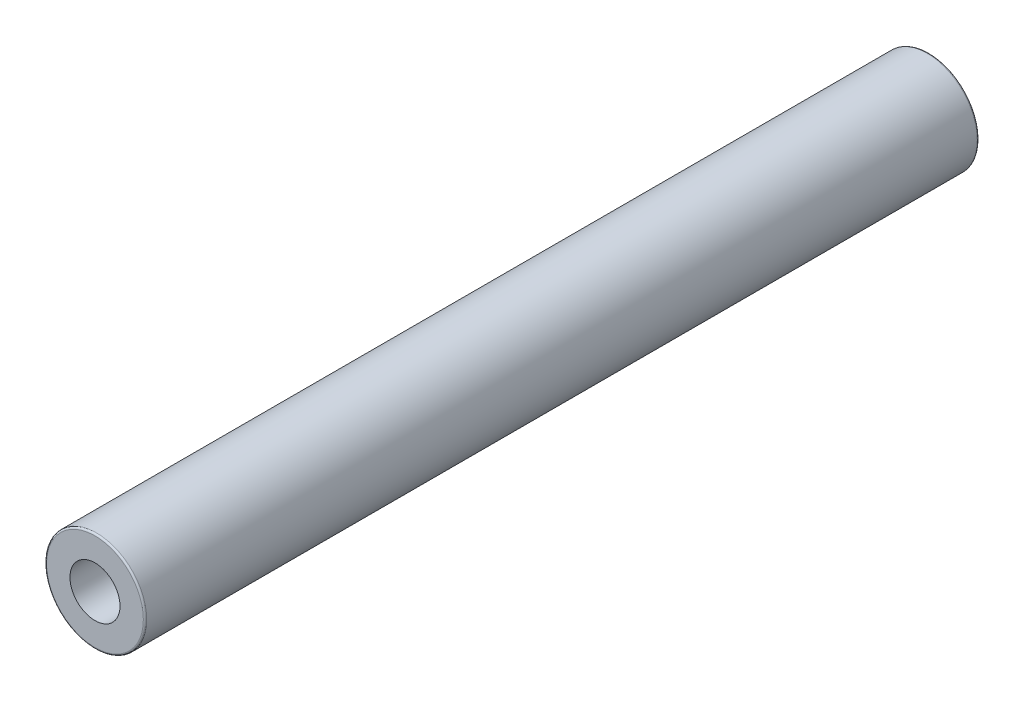
ISO-10303-21;
HEADER;
FILE_DESCRIPTION(('STEP AP214'),'2;1');
FILE_NAME('part.step','',(''),(''),'','','');
FILE_SCHEMA(('AUTOMOTIVE_DESIGN { 1 0 10303 214 1 1 1 1 }'));
ENDSEC;
DATA;
#1=APPLICATION_CONTEXT('core data for automotive mechanical design processes');
#2=APPLICATION_PROTOCOL_DEFINITION('international standard','automotive_design',2000,#1);
#3=PRODUCT_CONTEXT('',#1,'mechanical');
#4=PRODUCT('Part','Part','',(#3));
#5=PRODUCT_RELATED_PRODUCT_CATEGORY('part','',(#4));
#6=PRODUCT_DEFINITION_FORMATION('','',#4);
#7=PRODUCT_DEFINITION_CONTEXT('part definition',#1,'design');
#8=PRODUCT_DEFINITION('design','',#6,#7);
#9=PRODUCT_DEFINITION_SHAPE('','',#8);
#10=(LENGTH_UNIT() NAMED_UNIT(*) SI_UNIT(.MILLI.,.METRE.));
#11=(NAMED_UNIT(*) PLANE_ANGLE_UNIT() SI_UNIT($,.RADIAN.));
#12=(NAMED_UNIT(*) SI_UNIT($,.STERADIAN.) SOLID_ANGLE_UNIT());
#13=UNCERTAINTY_MEASURE_WITH_UNIT(LENGTH_MEASURE(1.E-05),#10,'distance_accuracy_value','');
#14=(GEOMETRIC_REPRESENTATION_CONTEXT(3) GLOBAL_UNCERTAINTY_ASSIGNED_CONTEXT((#13)) GLOBAL_UNIT_ASSIGNED_CONTEXT((#10,
#11,#12)) REPRESENTATION_CONTEXT('',''));
#15=CARTESIAN_POINT('',(0.,0.,0.));
#16=DIRECTION('',(0.,0.,1.));
#17=DIRECTION('',(1.,0.,0.));
#18=AXIS2_PLACEMENT_3D('',#15,#16,#17);
#19=CARTESIAN_POINT('',(0.,0.,50.));
#20=DIRECTION('',(0.,0.,1.));
#21=DIRECTION('',(1.,0.,0.));
#22=AXIS2_PLACEMENT_3D('',#19,#20,#21);
#23=PLANE('',#22);
#24=CARTESIAN_POINT('',(0.,0.,50.));
#25=DIRECTION('',(0.,0.,1.));
#26=DIRECTION('',(1.,0.,0.));
#27=AXIS2_PLACEMENT_3D('',#24,#25,#26);
#28=CIRCLE('',#27,2.9);
#29=CARTESIAN_POINT('',(2.9,0.,50.));
#30=VERTEX_POINT('',#29);
#31=EDGE_CURVE('E10',#30,#30,#28,.T.);
#32=ORIENTED_EDGE('',*,*,#31,.T.);
#33=EDGE_LOOP('',(#32));
#34=FACE_BOUND('',#33,.T.);
#35=CARTESIAN_POINT('',(0.,0.,50.));
#36=DIRECTION('',(0.,0.,1.));
#37=DIRECTION('',(1.,0.,0.));
#38=AXIS2_PLACEMENT_3D('',#35,#36,#37);
#39=CIRCLE('',#38,1.5);
#40=CARTESIAN_POINT('',(1.5,0.,50.));
#41=VERTEX_POINT('',#40);
#42=EDGE_CURVE('E61',#41,#41,#39,.T.);
#43=ORIENTED_EDGE('',*,*,#42,.F.);
#44=EDGE_LOOP('',(#43));
#45=FACE_BOUND('',#44,.T.);
#46=ADVANCED_FACE('F37',(#34,#45),#23,.T.);
#47=CARTESIAN_POINT('',(0.,0.,0.));
#48=DIRECTION('',(0.,0.,1.));
#49=DIRECTION('',(1.,0.,0.));
#50=AXIS2_PLACEMENT_3D('',#47,#48,#49);
#51=PLANE('',#50);
#52=CARTESIAN_POINT('',(0.,0.,0.));
#53=DIRECTION('',(0.,0.,1.));
#54=DIRECTION('',(1.,0.,0.));
#55=AXIS2_PLACEMENT_3D('',#52,#53,#54);
#56=CIRCLE('',#55,2.9);
#57=CARTESIAN_POINT('',(2.9,0.,0.));
#58=VERTEX_POINT('',#57);
#59=EDGE_CURVE('E45',#58,#58,#56,.F.);
#60=ORIENTED_EDGE('',*,*,#59,.T.);
#61=EDGE_LOOP('',(#60));
#62=FACE_BOUND('',#61,.T.);
#63=CARTESIAN_POINT('',(0.,0.,0.));
#64=DIRECTION('',(0.,0.,1.));
#65=DIRECTION('',(1.,0.,0.));
#66=AXIS2_PLACEMENT_3D('',#63,#64,#65);
#67=CIRCLE('',#66,1.5);
#68=CARTESIAN_POINT('',(1.5,0.,0.));
#69=VERTEX_POINT('',#68);
#70=EDGE_CURVE('E62',#69,#69,#67,.T.);
#71=ORIENTED_EDGE('',*,*,#70,.T.);
#72=EDGE_LOOP('',(#71));
#73=FACE_BOUND('',#72,.T.);
#74=ADVANCED_FACE('F74',(#62,#73),#51,.F.);
#75=CARTESIAN_POINT('',(0.,0.,50.));
#76=DIRECTION('',(0.,0.,-1.));
#77=DIRECTION('',(-1.,0.,0.));
#78=AXIS2_PLACEMENT_3D('',#75,#76,#77);
#79=CYLINDRICAL_SURFACE('',#78,3.);
#80=CARTESIAN_POINT('',(0.,0.,0.100000000000003));
#81=DIRECTION('',(0.,0.,1.));
#82=DIRECTION('',(1.,0.,0.));
#83=AXIS2_PLACEMENT_3D('',#80,#81,#82);
#84=CIRCLE('',#83,3.);
#85=CARTESIAN_POINT('',(3.,0.,0.100000000000003));
#86=VERTEX_POINT('',#85);
#87=EDGE_CURVE('E50',#86,#86,#84,.T.);
#88=ORIENTED_EDGE('',*,*,#87,.T.);
#89=EDGE_LOOP('',(#88));
#90=FACE_BOUND('',#89,.T.);
#91=CARTESIAN_POINT('',(0.,0.,49.9));
#92=DIRECTION('',(0.,0.,1.));
#93=DIRECTION('',(1.,0.,0.));
#94=AXIS2_PLACEMENT_3D('',#91,#92,#93);
#95=CIRCLE('',#94,3.);
#96=CARTESIAN_POINT('',(3.,0.,49.9));
#97=VERTEX_POINT('',#96);
#98=EDGE_CURVE('E55',#97,#97,#95,.F.);
#99=ORIENTED_EDGE('',*,*,#98,.T.);
#100=EDGE_LOOP('',(#99));
#101=FACE_BOUND('',#100,.T.);
#102=ADVANCED_FACE('F79',(#90,#101),#79,.T.);
#103=CARTESIAN_POINT('',(0.,0.,50.));
#104=DIRECTION('',(0.,0.,-1.));
#105=DIRECTION('',(-1.,0.,0.));
#106=AXIS2_PLACEMENT_3D('',#103,#104,#105);
#107=CYLINDRICAL_SURFACE('',#106,1.5);
#108=ORIENTED_EDGE('',*,*,#42,.T.);
#109=EDGE_LOOP('',(#108));
#110=FACE_BOUND('',#109,.T.);
#111=ORIENTED_EDGE('',*,*,#70,.F.);
#112=EDGE_LOOP('',(#111));
#113=FACE_BOUND('',#112,.T.);
#114=ADVANCED_FACE('F70',(#110,#113),#107,.F.);
#115=CARTESIAN_POINT('',(0.,0.,0.100000000000003));
#116=DIRECTION('',(0.,0.,1.));
#117=DIRECTION('',(1.,0.,0.));
#118=AXIS2_PLACEMENT_3D('',#115,#116,#117);
#119=TOROIDAL_SURFACE('',#118,2.9,0.1);
#120=ORIENTED_EDGE('',*,*,#59,.F.);
#121=EDGE_LOOP('',(#120));
#122=FACE_BOUND('',#121,.T.);
#123=ORIENTED_EDGE('',*,*,#87,.F.);
#124=EDGE_LOOP('',(#123));
#125=FACE_BOUND('',#124,.T.);
#126=ADVANCED_FACE('F85',(#122,#125),#119,.T.);
#127=CARTESIAN_POINT('',(0.,0.,49.9));
#128=DIRECTION('',(0.,0.,1.));
#129=DIRECTION('',(1.,0.,0.));
#130=AXIS2_PLACEMENT_3D('',#127,#128,#129);
#131=TOROIDAL_SURFACE('',#130,2.9,0.1);
#132=ORIENTED_EDGE('',*,*,#98,.F.);
#133=EDGE_LOOP('',(#132));
#134=FACE_BOUND('',#133,.T.);
#135=ORIENTED_EDGE('',*,*,#31,.F.);
#136=EDGE_LOOP('',(#135));
#137=FACE_BOUND('',#136,.T.);
#138=ADVANCED_FACE('F39',(#134,#137),#131,.T.);
#139=CLOSED_SHELL('',(#46,#74,#102,#114,#126,#138));
#140=MANIFOLD_SOLID_BREP('B2',#139);
#141=ADVANCED_BREP_SHAPE_REPRESENTATION('',(#18,#140),#14);
#142=SHAPE_DEFINITION_REPRESENTATION(#9,#141);
ENDSEC;
END-ISO-10303-21;
